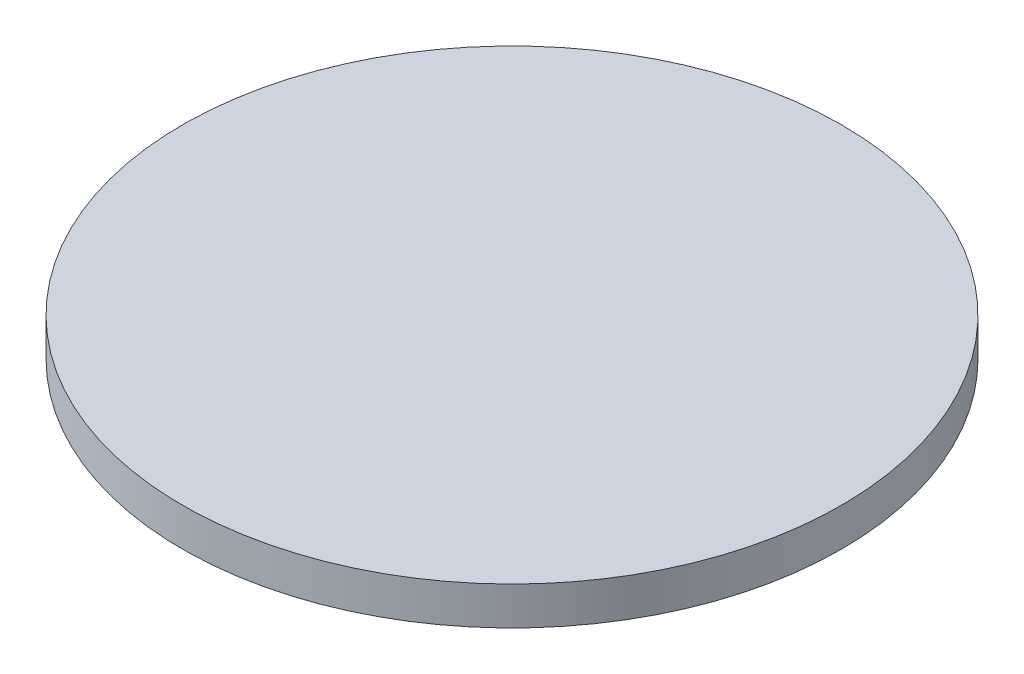
ISO-10303-21;
HEADER;
FILE_DESCRIPTION(('STEP AP214'),'2;1');
FILE_NAME('part.step','',(''),(''),'','','');
FILE_SCHEMA(('AUTOMOTIVE_DESIGN { 1 0 10303 214 1 1 1 1 }'));
ENDSEC;
DATA;
#1=APPLICATION_CONTEXT('core data for automotive mechanical design processes');
#2=APPLICATION_PROTOCOL_DEFINITION('international standard','automotive_design',2000,#1);
#3=PRODUCT_CONTEXT('',#1,'mechanical');
#4=PRODUCT('Part','Part','',(#3));
#5=PRODUCT_RELATED_PRODUCT_CATEGORY('part','',(#4));
#6=PRODUCT_DEFINITION_FORMATION('','',#4);
#7=PRODUCT_DEFINITION_CONTEXT('part definition',#1,'design');
#8=PRODUCT_DEFINITION('design','',#6,#7);
#9=PRODUCT_DEFINITION_SHAPE('','',#8);
#10=(LENGTH_UNIT() NAMED_UNIT(*) SI_UNIT(.MILLI.,.METRE.));
#11=(NAMED_UNIT(*) PLANE_ANGLE_UNIT() SI_UNIT($,.RADIAN.));
#12=(NAMED_UNIT(*) SI_UNIT($,.STERADIAN.) SOLID_ANGLE_UNIT());
#13=UNCERTAINTY_MEASURE_WITH_UNIT(LENGTH_MEASURE(1.E-05),#10,'distance_accuracy_value','');
#14=(GEOMETRIC_REPRESENTATION_CONTEXT(3) GLOBAL_UNCERTAINTY_ASSIGNED_CONTEXT((#13)) GLOBAL_UNIT_ASSIGNED_CONTEXT((#10,
#11,#12)) REPRESENTATION_CONTEXT('',''));
#15=CARTESIAN_POINT('',(0.,0.,0.));
#16=DIRECTION('',(0.,0.,1.));
#17=DIRECTION('',(1.,0.,0.));
#18=AXIS2_PLACEMENT_3D('',#15,#16,#17);
#19=CARTESIAN_POINT('',(0.,170.92349137931,0.));
#20=DIRECTION('',(0.,-1.,0.));
#21=DIRECTION('',(1.,0.,0.));
#22=AXIS2_PLACEMENT_3D('',#19,#20,#21);
#23=SPHERICAL_SURFACE('',#22,170.92349137931);
#24=CARTESIAN_POINT('',(0.,29.,0.));
#25=DIRECTION('',(0.,-1.,0.));
#26=DIRECTION('',(0.,0.,-1.));
#27=AXIS2_PLACEMENT_3D('',#24,#25,#26);
#28=CIRCLE('',#27,95.25);
#29=CARTESIAN_POINT('',(0.,29.,-95.25));
#30=VERTEX_POINT('',#29);
#31=EDGE_CURVE('E10',#30,#30,#28,.T.);
#32=ORIENTED_EDGE('',*,*,#31,.T.);
#33=EDGE_LOOP('',(#32));
#34=FACE_BOUND('',#33,.T.);
#35=ADVANCED_FACE('F30',(#34),#23,.T.);
#36=CARTESIAN_POINT('',(0.,0.,0.));
#37=DIRECTION('',(0.,-1.,0.));
#38=DIRECTION('',(0.,0.,-1.));
#39=AXIS2_PLACEMENT_3D('',#36,#37,#38);
#40=CYLINDRICAL_SURFACE('',#39,95.25);
#41=CARTESIAN_POINT('',(0.,40.,0.));
#42=DIRECTION('',(0.,-1.,0.));
#43=DIRECTION('',(0.,0.,-1.));
#44=AXIS2_PLACEMENT_3D('',#41,#42,#43);
#45=CIRCLE('',#44,95.25);
#46=CARTESIAN_POINT('',(0.,40.,-95.25));
#47=VERTEX_POINT('',#46);
#48=EDGE_CURVE('E36',#47,#47,#45,.T.);
#49=ORIENTED_EDGE('',*,*,#48,.T.);
#50=EDGE_LOOP('',(#49));
#51=FACE_BOUND('',#50,.T.);
#52=ORIENTED_EDGE('',*,*,#31,.F.);
#53=EDGE_LOOP('',(#52));
#54=FACE_BOUND('',#53,.T.);
#55=ADVANCED_FACE('F42',(#51,#54),#40,.T.);
#56=CARTESIAN_POINT('',(0.,40.,0.));
#57=DIRECTION('',(0.,1.,0.));
#58=DIRECTION('',(0.,0.,1.));
#59=AXIS2_PLACEMENT_3D('',#56,#57,#58);
#60=PLANE('',#59);
#61=ORIENTED_EDGE('',*,*,#48,.F.);
#62=EDGE_LOOP('',(#61));
#63=FACE_BOUND('',#62,.T.);
#64=ADVANCED_FACE('F45',(#63),#60,.T.);
#65=CLOSED_SHELL('',(#35,#55,#64));
#66=MANIFOLD_SOLID_BREP('B2',#65);
#67=ADVANCED_BREP_SHAPE_REPRESENTATION('',(#18,#66),#14);
#68=SHAPE_DEFINITION_REPRESENTATION(#9,#67);
ENDSEC;
END-ISO-10303-21;
